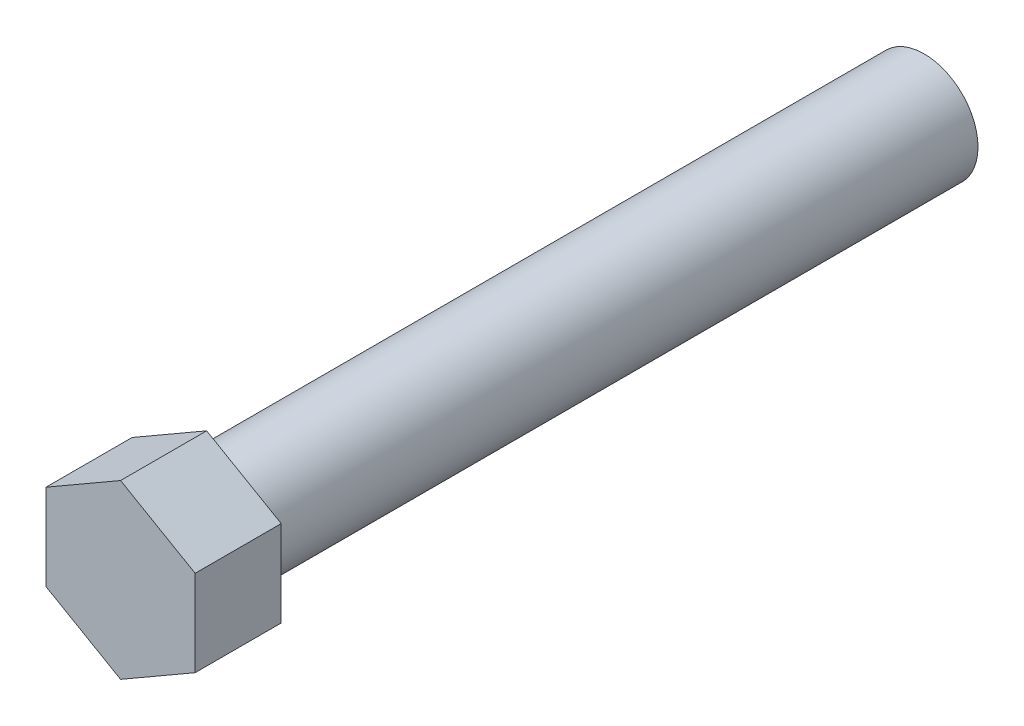
ISO-10303-21;
HEADER;
FILE_DESCRIPTION(('STEP AP214'),'2;1');
FILE_NAME('part.step','',(''),(''),'','','');
FILE_SCHEMA(('AUTOMOTIVE_DESIGN { 1 0 10303 214 1 1 1 1 }'));
ENDSEC;
DATA;
#1=APPLICATION_CONTEXT('core data for automotive mechanical design processes');
#2=APPLICATION_PROTOCOL_DEFINITION('international standard','automotive_design',2000,#1);
#3=PRODUCT_CONTEXT('',#1,'mechanical');
#4=PRODUCT('Part','Part','',(#3));
#5=PRODUCT_RELATED_PRODUCT_CATEGORY('part','',(#4));
#6=PRODUCT_DEFINITION_FORMATION('','',#4);
#7=PRODUCT_DEFINITION_CONTEXT('part definition',#1,'design');
#8=PRODUCT_DEFINITION('design','',#6,#7);
#9=PRODUCT_DEFINITION_SHAPE('','',#8);
#10=(LENGTH_UNIT() NAMED_UNIT(*) SI_UNIT(.MILLI.,.METRE.));
#11=(NAMED_UNIT(*) PLANE_ANGLE_UNIT() SI_UNIT($,.RADIAN.));
#12=(NAMED_UNIT(*) SI_UNIT($,.STERADIAN.) SOLID_ANGLE_UNIT());
#13=UNCERTAINTY_MEASURE_WITH_UNIT(LENGTH_MEASURE(1.E-05),#10,'distance_accuracy_value','');
#14=(GEOMETRIC_REPRESENTATION_CONTEXT(3) GLOBAL_UNCERTAINTY_ASSIGNED_CONTEXT((#13)) GLOBAL_UNIT_ASSIGNED_CONTEXT((#10,
#11,#12)) REPRESENTATION_CONTEXT('',''));
#15=CARTESIAN_POINT('',(0.,0.,0.));
#16=DIRECTION('',(0.,0.,1.));
#17=DIRECTION('',(1.,0.,0.));
#18=AXIS2_PLACEMENT_3D('',#15,#16,#17);
#19=CARTESIAN_POINT('',(0.,0.,100.));
#20=DIRECTION('',(0.,0.,-1.));
#21=DIRECTION('',(-1.,0.,0.));
#22=AXIS2_PLACEMENT_3D('',#19,#20,#21);
#23=CYLINDRICAL_SURFACE('',#22,7.5);
#24=CARTESIAN_POINT('',(0.,0.,100.));
#25=DIRECTION('',(0.,0.,1.));
#26=DIRECTION('',(1.,0.,0.));
#27=AXIS2_PLACEMENT_3D('',#24,#25,#26);
#28=CIRCLE('',#27,7.5);
#29=CARTESIAN_POINT('',(7.5,0.,100.));
#30=VERTEX_POINT('',#29);
#31=EDGE_CURVE('E11',#30,#30,#28,.T.);
#32=ORIENTED_EDGE('',*,*,#31,.F.);
#33=EDGE_LOOP('',(#32));
#34=FACE_BOUND('',#33,.T.);
#35=CARTESIAN_POINT('',(0.,0.,0.));
#36=DIRECTION('',(0.,0.,1.));
#37=DIRECTION('',(1.,0.,0.));
#38=AXIS2_PLACEMENT_3D('',#35,#36,#37);
#39=CIRCLE('',#38,7.5);
#40=CARTESIAN_POINT('',(7.5,0.,0.));
#41=VERTEX_POINT('',#40);
#42=EDGE_CURVE('E42',#41,#41,#39,.T.);
#43=ORIENTED_EDGE('',*,*,#42,.T.);
#44=EDGE_LOOP('',(#43));
#45=FACE_BOUND('',#44,.T.);
#46=ADVANCED_FACE('F39',(#34,#45),#23,.T.);
#47=CARTESIAN_POINT('',(0.,0.,0.));
#48=DIRECTION('',(0.,0.,1.));
#49=DIRECTION('',(1.,0.,0.));
#50=AXIS2_PLACEMENT_3D('',#47,#48,#49);
#51=PLANE('',#50);
#52=ORIENTED_EDGE('',*,*,#42,.F.);
#53=EDGE_LOOP('',(#52));
#54=FACE_BOUND('',#53,.T.);
#55=ADVANCED_FACE('F164',(#54),#51,.F.);
#56=CARTESIAN_POINT('',(-10.3923048454133,-6.,112.));
#57=DIRECTION('',(0.5,0.866025403784438,0.));
#58=DIRECTION('',(-0.866025403784439,0.5,0.));
#59=AXIS2_PLACEMENT_3D('',#56,#57,#58);
#60=PLANE('',#59);
#61=DIRECTION('',(0.866025403784439,-0.5,0.));
#62=VECTOR('',#61,1.);
#63=CARTESIAN_POINT('',(-10.3923048454133,-6.,100.));
#64=LINE('',#63,#62);
#65=CARTESIAN_POINT('',(-10.3923048454133,-6.,100.));
#66=VERTEX_POINT('',#65);
#67=CARTESIAN_POINT('',(0.,-12.,100.));
#68=VERTEX_POINT('',#67);
#69=EDGE_CURVE('E129',#66,#68,#64,.T.);
#70=ORIENTED_EDGE('',*,*,#69,.T.);
#71=DIRECTION('',(0.,0.,-1.));
#72=VECTOR('',#71,1.);
#73=CARTESIAN_POINT('',(0.,-12.,112.));
#74=LINE('',#73,#72);
#75=CARTESIAN_POINT('',(0.,-12.,112.));
#76=VERTEX_POINT('',#75);
#77=EDGE_CURVE('E156',#76,#68,#74,.T.);
#78=ORIENTED_EDGE('',*,*,#77,.F.);
#79=DIRECTION('',(0.866025403784439,-0.5,0.));
#80=VECTOR('',#79,1.);
#81=CARTESIAN_POINT('',(-10.3923048454133,-6.,112.));
#82=LINE('',#81,#80);
#83=CARTESIAN_POINT('',(-10.3923048454133,-6.,112.));
#84=VERTEX_POINT('',#83);
#85=EDGE_CURVE('E145',#84,#76,#82,.T.);
#86=ORIENTED_EDGE('',*,*,#85,.F.);
#87=DIRECTION('',(0.,0.,-1.));
#88=VECTOR('',#87,1.);
#89=CARTESIAN_POINT('',(-10.3923048454133,-6.,112.));
#90=LINE('',#89,#88);
#91=EDGE_CURVE('E125',#84,#66,#90,.T.);
#92=ORIENTED_EDGE('',*,*,#91,.T.);
#93=EDGE_LOOP('',(#70,#78,#86,#92));
#94=FACE_BOUND('',#93,.T.);
#95=ADVANCED_FACE('F166',(#94),#60,.F.);
#96=CARTESIAN_POINT('',(0.,-12.,112.));
#97=DIRECTION('',(-0.5,0.866025403784438,0.));
#98=DIRECTION('',(-0.866025403784439,-0.5,0.));
#99=AXIS2_PLACEMENT_3D('',#96,#97,#98);
#100=PLANE('',#99);
#101=DIRECTION('',(0.866025403784438,0.5,0.));
#102=VECTOR('',#101,1.);
#103=CARTESIAN_POINT('',(0.,-12.,100.));
#104=LINE('',#103,#102);
#105=CARTESIAN_POINT('',(10.3923048454133,-6.,100.));
#106=VERTEX_POINT('',#105);
#107=EDGE_CURVE('E133',#68,#106,#104,.T.);
#108=ORIENTED_EDGE('',*,*,#107,.T.);
#109=DIRECTION('',(0.,0.,-1.));
#110=VECTOR('',#109,1.);
#111=CARTESIAN_POINT('',(10.3923048454133,-6.,112.));
#112=LINE('',#111,#110);
#113=CARTESIAN_POINT('',(10.3923048454133,-6.,112.));
#114=VERTEX_POINT('',#113);
#115=EDGE_CURVE('E152',#114,#106,#112,.T.);
#116=ORIENTED_EDGE('',*,*,#115,.F.);
#117=DIRECTION('',(0.866025403784438,0.5,0.));
#118=VECTOR('',#117,1.);
#119=CARTESIAN_POINT('',(0.,-12.,112.));
#120=LINE('',#119,#118);
#121=EDGE_CURVE('E94',#76,#114,#120,.T.);
#122=ORIENTED_EDGE('',*,*,#121,.F.);
#123=ORIENTED_EDGE('',*,*,#77,.T.);
#124=EDGE_LOOP('',(#108,#116,#122,#123));
#125=FACE_BOUND('',#124,.T.);
#126=ADVANCED_FACE('F171',(#125),#100,.F.);
#127=CARTESIAN_POINT('',(10.3923048454133,-6.,112.));
#128=DIRECTION('',(-1.,0.,0.));
#129=DIRECTION('',(0.,-1.,0.));
#130=AXIS2_PLACEMENT_3D('',#127,#128,#129);
#131=PLANE('',#130);
#132=DIRECTION('',(0.,1.,0.));
#133=VECTOR('',#132,1.);
#134=CARTESIAN_POINT('',(10.3923048454133,-6.,100.));
#135=LINE('',#134,#133);
#136=CARTESIAN_POINT('',(10.3923048454133,6.,100.));
#137=VERTEX_POINT('',#136);
#138=EDGE_CURVE('E136',#106,#137,#135,.T.);
#139=ORIENTED_EDGE('',*,*,#138,.T.);
#140=DIRECTION('',(0.,0.,-1.));
#141=VECTOR('',#140,1.);
#142=CARTESIAN_POINT('',(10.3923048454133,6.,112.));
#143=LINE('',#142,#141);
#144=CARTESIAN_POINT('',(10.3923048454133,6.,112.));
#145=VERTEX_POINT('',#144);
#146=EDGE_CURVE('E118',#145,#137,#143,.T.);
#147=ORIENTED_EDGE('',*,*,#146,.F.);
#148=DIRECTION('',(0.,1.,0.));
#149=VECTOR('',#148,1.);
#150=CARTESIAN_POINT('',(10.3923048454133,-6.,112.));
#151=LINE('',#150,#149);
#152=EDGE_CURVE('E107',#114,#145,#151,.T.);
#153=ORIENTED_EDGE('',*,*,#152,.F.);
#154=ORIENTED_EDGE('',*,*,#115,.T.);
#155=EDGE_LOOP('',(#139,#147,#153,#154));
#156=FACE_BOUND('',#155,.T.);
#157=ADVANCED_FACE('F178',(#156),#131,.F.);
#158=CARTESIAN_POINT('',(10.3923048454133,6.,112.));
#159=DIRECTION('',(-0.5,-0.866025403784438,0.));
#160=DIRECTION('',(0.866025403784439,-0.5,0.));
#161=AXIS2_PLACEMENT_3D('',#158,#159,#160);
#162=PLANE('',#161);
#163=DIRECTION('',(-0.866025403784439,0.5,0.));
#164=VECTOR('',#163,1.);
#165=CARTESIAN_POINT('',(10.3923048454133,6.,100.));
#166=LINE('',#165,#164);
#167=CARTESIAN_POINT('',(0.,12.,100.));
#168=VERTEX_POINT('',#167);
#169=EDGE_CURVE('E116',#137,#168,#166,.T.);
#170=ORIENTED_EDGE('',*,*,#169,.T.);
#171=DIRECTION('',(0.,0.,-1.));
#172=VECTOR('',#171,1.);
#173=CARTESIAN_POINT('',(0.,12.,112.));
#174=LINE('',#173,#172);
#175=CARTESIAN_POINT('',(0.,12.,112.));
#176=VERTEX_POINT('',#175);
#177=EDGE_CURVE('E113',#176,#168,#174,.T.);
#178=ORIENTED_EDGE('',*,*,#177,.F.);
#179=DIRECTION('',(-0.866025403784439,0.5,0.));
#180=VECTOR('',#179,1.);
#181=CARTESIAN_POINT('',(10.3923048454133,6.,112.));
#182=LINE('',#181,#180);
#183=EDGE_CURVE('E101',#145,#176,#182,.T.);
#184=ORIENTED_EDGE('',*,*,#183,.F.);
#185=ORIENTED_EDGE('',*,*,#146,.T.);
#186=EDGE_LOOP('',(#170,#178,#184,#185));
#187=FACE_BOUND('',#186,.T.);
#188=ADVANCED_FACE('F114',(#187),#162,.F.);
#189=CARTESIAN_POINT('',(0.,12.,112.));
#190=DIRECTION('',(0.5,-0.866025403784439,0.));
#191=DIRECTION('',(0.866025403784439,0.5,0.));
#192=AXIS2_PLACEMENT_3D('',#189,#190,#191);
#193=PLANE('',#192);
#194=DIRECTION('',(-0.866025403784439,-0.5,0.));
#195=VECTOR('',#194,1.);
#196=CARTESIAN_POINT('',(0.,12.,100.));
#197=LINE('',#196,#195);
#198=CARTESIAN_POINT('',(-10.3923048454133,6.,100.));
#199=VERTEX_POINT('',#198);
#200=EDGE_CURVE('E79',#168,#199,#197,.T.);
#201=ORIENTED_EDGE('',*,*,#200,.T.);
#202=DIRECTION('',(0.,0.,-1.));
#203=VECTOR('',#202,1.);
#204=CARTESIAN_POINT('',(-10.3923048454133,6.,112.));
#205=LINE('',#204,#203);
#206=CARTESIAN_POINT('',(-10.3923048454133,6.,112.));
#207=VERTEX_POINT('',#206);
#208=EDGE_CURVE('E119',#207,#199,#205,.T.);
#209=ORIENTED_EDGE('',*,*,#208,.F.);
#210=DIRECTION('',(-0.866025403784439,-0.5,0.));
#211=VECTOR('',#210,1.);
#212=CARTESIAN_POINT('',(0.,12.,112.));
#213=LINE('',#212,#211);
#214=EDGE_CURVE('E105',#176,#207,#213,.T.);
#215=ORIENTED_EDGE('',*,*,#214,.F.);
#216=ORIENTED_EDGE('',*,*,#177,.T.);
#217=EDGE_LOOP('',(#201,#209,#215,#216));
#218=FACE_BOUND('',#217,.T.);
#219=ADVANCED_FACE('F121',(#218),#193,.F.);
#220=CARTESIAN_POINT('',(-10.3923048454133,6.,112.));
#221=DIRECTION('',(1.,0.,0.));
#222=DIRECTION('',(0.,0.,-1.));
#223=AXIS2_PLACEMENT_3D('',#220,#221,#222);
#224=PLANE('',#223);
#225=DIRECTION('',(0.,-1.,0.));
#226=VECTOR('',#225,1.);
#227=CARTESIAN_POINT('',(-10.3923048454133,6.,100.));
#228=LINE('',#227,#226);
#229=EDGE_CURVE('E85',#199,#66,#228,.T.);
#230=ORIENTED_EDGE('',*,*,#229,.T.);
#231=ORIENTED_EDGE('',*,*,#91,.F.);
#232=DIRECTION('',(0.,-1.,0.));
#233=VECTOR('',#232,1.);
#234=CARTESIAN_POINT('',(-10.3923048454133,6.,112.));
#235=LINE('',#234,#233);
#236=EDGE_CURVE('E56',#207,#84,#235,.T.);
#237=ORIENTED_EDGE('',*,*,#236,.F.);
#238=ORIENTED_EDGE('',*,*,#208,.T.);
#239=EDGE_LOOP('',(#230,#231,#237,#238));
#240=FACE_BOUND('',#239,.T.);
#241=ADVANCED_FACE('F186',(#240),#224,.F.);
#242=CARTESIAN_POINT('',(0.,0.,112.));
#243=DIRECTION('',(0.,0.,1.));
#244=DIRECTION('',(1.,0.,0.));
#245=AXIS2_PLACEMENT_3D('',#242,#243,#244);
#246=PLANE('',#245);
#247=ORIENTED_EDGE('',*,*,#85,.T.);
#248=ORIENTED_EDGE('',*,*,#121,.T.);
#249=ORIENTED_EDGE('',*,*,#152,.T.);
#250=ORIENTED_EDGE('',*,*,#183,.T.);
#251=ORIENTED_EDGE('',*,*,#214,.T.);
#252=ORIENTED_EDGE('',*,*,#236,.T.);
#253=EDGE_LOOP('',(#247,#248,#249,#250,#251,#252));
#254=FACE_BOUND('',#253,.T.);
#255=ADVANCED_FACE('F103',(#254),#246,.T.);
#256=CARTESIAN_POINT('',(0.,0.,100.));
#257=DIRECTION('',(0.,0.,1.));
#258=DIRECTION('',(1.,0.,0.));
#259=AXIS2_PLACEMENT_3D('',#256,#257,#258);
#260=PLANE('',#259);
#261=ORIENTED_EDGE('',*,*,#31,.T.);
#262=EDGE_LOOP('',(#261));
#263=FACE_BOUND('',#262,.T.);
#264=ORIENTED_EDGE('',*,*,#69,.F.);
#265=ORIENTED_EDGE('',*,*,#229,.F.);
#266=ORIENTED_EDGE('',*,*,#200,.F.);
#267=ORIENTED_EDGE('',*,*,#169,.F.);
#268=ORIENTED_EDGE('',*,*,#138,.F.);
#269=ORIENTED_EDGE('',*,*,#107,.F.);
#270=EDGE_LOOP('',(#264,#265,#266,#267,#268,#269));
#271=FACE_BOUND('',#270,.T.);
#272=ADVANCED_FACE('F189',(#263,#271),#260,.F.);
#273=CLOSED_SHELL('',(#46,#55,#95,#126,#157,#188,#219,#241,#255,#272));
#274=MANIFOLD_SOLID_BREP('B2',#273);
#275=ADVANCED_BREP_SHAPE_REPRESENTATION('',(#18,#274),#14);
#276=SHAPE_DEFINITION_REPRESENTATION(#9,#275);
ENDSEC;
END-ISO-10303-21;
